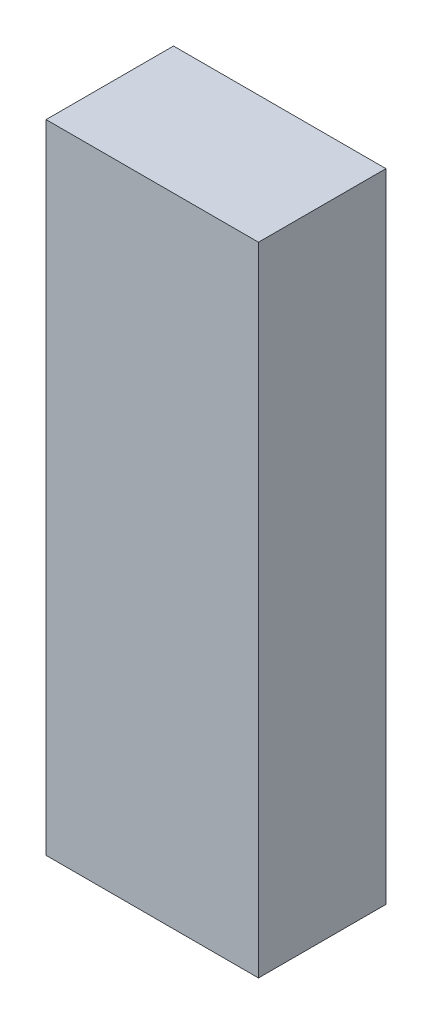
ISO-10303-21;
HEADER;
FILE_DESCRIPTION(('STEP AP214'),'2;1');
FILE_NAME('part.step','',(''),(''),'','','');
FILE_SCHEMA(('AUTOMOTIVE_DESIGN { 1 0 10303 214 1 1 1 1 }'));
ENDSEC;
DATA;
#1=APPLICATION_CONTEXT('core data for automotive mechanical design processes');
#2=APPLICATION_PROTOCOL_DEFINITION('international standard','automotive_design',2000,#1);
#3=PRODUCT_CONTEXT('',#1,'mechanical');
#4=PRODUCT('Part','Part','',(#3));
#5=PRODUCT_RELATED_PRODUCT_CATEGORY('part','',(#4));
#6=PRODUCT_DEFINITION_FORMATION('','',#4);
#7=PRODUCT_DEFINITION_CONTEXT('part definition',#1,'design');
#8=PRODUCT_DEFINITION('design','',#6,#7);
#9=PRODUCT_DEFINITION_SHAPE('','',#8);
#10=(LENGTH_UNIT() NAMED_UNIT(*) SI_UNIT(.MILLI.,.METRE.));
#11=(NAMED_UNIT(*) PLANE_ANGLE_UNIT() SI_UNIT($,.RADIAN.));
#12=(NAMED_UNIT(*) SI_UNIT($,.STERADIAN.) SOLID_ANGLE_UNIT());
#13=UNCERTAINTY_MEASURE_WITH_UNIT(LENGTH_MEASURE(1.E-05),#10,'distance_accuracy_value','');
#14=(GEOMETRIC_REPRESENTATION_CONTEXT(3) GLOBAL_UNCERTAINTY_ASSIGNED_CONTEXT((#13)) GLOBAL_UNIT_ASSIGNED_CONTEXT((#10,
#11,#12)) REPRESENTATION_CONTEXT('',''));
#15=CARTESIAN_POINT('',(0.,0.,0.));
#16=DIRECTION('',(0.,0.,1.));
#17=DIRECTION('',(1.,0.,0.));
#18=AXIS2_PLACEMENT_3D('',#15,#16,#17);
#19=CARTESIAN_POINT('',(25.,-75.,30.));
#20=DIRECTION('',(-1.,0.,0.));
#21=DIRECTION('',(0.,0.,1.));
#22=AXIS2_PLACEMENT_3D('',#19,#20,#21);
#23=PLANE('',#22);
#24=DIRECTION('',(0.,1.,0.));
#25=VECTOR('',#24,1.);
#26=CARTESIAN_POINT('',(25.,-75.,0.));
#27=LINE('',#26,#25);
#28=CARTESIAN_POINT('',(25.,-75.,0.));
#29=VERTEX_POINT('',#28);
#30=CARTESIAN_POINT('',(25.,75.,0.));
#31=VERTEX_POINT('',#30);
#32=EDGE_CURVE('E113',#29,#31,#27,.T.);
#33=ORIENTED_EDGE('',*,*,#32,.T.);
#34=DIRECTION('',(0.,0.,-1.));
#35=VECTOR('',#34,1.);
#36=CARTESIAN_POINT('',(25.,75.,30.));
#37=LINE('',#36,#35);
#38=CARTESIAN_POINT('',(25.,75.,30.));
#39=VERTEX_POINT('',#38);
#40=EDGE_CURVE('E11',#39,#31,#37,.T.);
#41=ORIENTED_EDGE('',*,*,#40,.F.);
#42=DIRECTION('',(0.,1.,0.));
#43=VECTOR('',#42,1.);
#44=CARTESIAN_POINT('',(25.,-75.,30.));
#45=LINE('',#44,#43);
#46=CARTESIAN_POINT('',(25.,-75.,30.));
#47=VERTEX_POINT('',#46);
#48=EDGE_CURVE('E97',#47,#39,#45,.T.);
#49=ORIENTED_EDGE('',*,*,#48,.F.);
#50=DIRECTION('',(0.,0.,-1.));
#51=VECTOR('',#50,1.);
#52=CARTESIAN_POINT('',(25.,-75.,30.));
#53=LINE('',#52,#51);
#54=EDGE_CURVE('E109',#47,#29,#53,.T.);
#55=ORIENTED_EDGE('',*,*,#54,.T.);
#56=EDGE_LOOP('',(#33,#41,#49,#55));
#57=FACE_BOUND('',#56,.T.);
#58=ADVANCED_FACE('F45',(#57),#23,.F.);
#59=CARTESIAN_POINT('',(-25.,75.,30.));
#60=DIRECTION('',(0.,-1.,0.));
#61=DIRECTION('',(0.,0.,-1.));
#62=AXIS2_PLACEMENT_3D('',#59,#60,#61);
#63=PLANE('',#62);
#64=DIRECTION('',(-1.,0.,0.));
#65=VECTOR('',#64,1.);
#66=CARTESIAN_POINT('',(-25.,75.,0.));
#67=LINE('',#66,#65);
#68=CARTESIAN_POINT('',(-25.,75.,0.));
#69=VERTEX_POINT('',#68);
#70=EDGE_CURVE('E102',#31,#69,#67,.T.);
#71=ORIENTED_EDGE('',*,*,#70,.T.);
#72=DIRECTION('',(0.,0.,-1.));
#73=VECTOR('',#72,1.);
#74=CARTESIAN_POINT('',(-25.,75.,30.));
#75=LINE('',#74,#73);
#76=CARTESIAN_POINT('',(-25.,75.,30.));
#77=VERTEX_POINT('',#76);
#78=EDGE_CURVE('E54',#77,#69,#75,.T.);
#79=ORIENTED_EDGE('',*,*,#78,.F.);
#80=DIRECTION('',(-1.,0.,0.));
#81=VECTOR('',#80,1.);
#82=CARTESIAN_POINT('',(-25.,75.,30.));
#83=LINE('',#82,#81);
#84=EDGE_CURVE('E92',#39,#77,#83,.T.);
#85=ORIENTED_EDGE('',*,*,#84,.F.);
#86=ORIENTED_EDGE('',*,*,#40,.T.);
#87=EDGE_LOOP('',(#71,#79,#85,#86));
#88=FACE_BOUND('',#87,.T.);
#89=ADVANCED_FACE('F101',(#88),#63,.F.);
#90=CARTESIAN_POINT('',(-25.,-75.,30.));
#91=DIRECTION('',(1.,0.,0.));
#92=DIRECTION('',(0.,0.,-1.));
#93=AXIS2_PLACEMENT_3D('',#90,#91,#92);
#94=PLANE('',#93);
#95=DIRECTION('',(0.,-1.,0.));
#96=VECTOR('',#95,1.);
#97=CARTESIAN_POINT('',(-25.,-75.,0.));
#98=LINE('',#97,#96);
#99=CARTESIAN_POINT('',(-25.,-75.,0.));
#100=VERTEX_POINT('',#99);
#101=EDGE_CURVE('E79',#69,#100,#98,.T.);
#102=ORIENTED_EDGE('',*,*,#101,.T.);
#103=DIRECTION('',(0.,0.,-1.));
#104=VECTOR('',#103,1.);
#105=CARTESIAN_POINT('',(-25.,-75.,30.));
#106=LINE('',#105,#104);
#107=CARTESIAN_POINT('',(-25.,-75.,30.));
#108=VERTEX_POINT('',#107);
#109=EDGE_CURVE('E104',#108,#100,#106,.T.);
#110=ORIENTED_EDGE('',*,*,#109,.F.);
#111=DIRECTION('',(0.,-1.,0.));
#112=VECTOR('',#111,1.);
#113=CARTESIAN_POINT('',(-25.,-75.,30.));
#114=LINE('',#113,#112);
#115=EDGE_CURVE('E95',#77,#108,#114,.T.);
#116=ORIENTED_EDGE('',*,*,#115,.F.);
#117=ORIENTED_EDGE('',*,*,#78,.T.);
#118=EDGE_LOOP('',(#102,#110,#116,#117));
#119=FACE_BOUND('',#118,.T.);
#120=ADVANCED_FACE('F105',(#119),#94,.F.);
#121=CARTESIAN_POINT('',(-25.,-75.,30.));
#122=DIRECTION('',(0.,1.,0.));
#123=DIRECTION('',(0.,0.,1.));
#124=AXIS2_PLACEMENT_3D('',#121,#122,#123);
#125=PLANE('',#124);
#126=DIRECTION('',(1.,0.,0.));
#127=VECTOR('',#126,1.);
#128=CARTESIAN_POINT('',(-25.,-75.,0.));
#129=LINE('',#128,#127);
#130=EDGE_CURVE('E85',#100,#29,#129,.T.);
#131=ORIENTED_EDGE('',*,*,#130,.T.);
#132=ORIENTED_EDGE('',*,*,#54,.F.);
#133=DIRECTION('',(1.,0.,0.));
#134=VECTOR('',#133,1.);
#135=CARTESIAN_POINT('',(-25.,-75.,30.));
#136=LINE('',#135,#134);
#137=EDGE_CURVE('E62',#108,#47,#136,.T.);
#138=ORIENTED_EDGE('',*,*,#137,.F.);
#139=ORIENTED_EDGE('',*,*,#109,.T.);
#140=EDGE_LOOP('',(#131,#132,#138,#139));
#141=FACE_BOUND('',#140,.T.);
#142=ADVANCED_FACE('F126',(#141),#125,.F.);
#143=CARTESIAN_POINT('',(0.,0.,30.));
#144=DIRECTION('',(0.,0.,-1.));
#145=DIRECTION('',(-1.,0.,0.));
#146=AXIS2_PLACEMENT_3D('',#143,#144,#145);
#147=PLANE('',#146);
#148=ORIENTED_EDGE('',*,*,#48,.T.);
#149=ORIENTED_EDGE('',*,*,#84,.T.);
#150=ORIENTED_EDGE('',*,*,#115,.T.);
#151=ORIENTED_EDGE('',*,*,#137,.T.);
#152=EDGE_LOOP('',(#148,#149,#150,#151));
#153=FACE_BOUND('',#152,.T.);
#154=ADVANCED_FACE('F93',(#153),#147,.F.);
#155=CARTESIAN_POINT('',(0.,0.,0.));
#156=DIRECTION('',(0.,0.,-1.));
#157=DIRECTION('',(-1.,0.,0.));
#158=AXIS2_PLACEMENT_3D('',#155,#156,#157);
#159=PLANE('',#158);
#160=ORIENTED_EDGE('',*,*,#32,.F.);
#161=ORIENTED_EDGE('',*,*,#130,.F.);
#162=ORIENTED_EDGE('',*,*,#101,.F.);
#163=ORIENTED_EDGE('',*,*,#70,.F.);
#164=EDGE_LOOP('',(#160,#161,#162,#163));
#165=FACE_BOUND('',#164,.T.);
#166=ADVANCED_FACE('F129',(#165),#159,.T.);
#167=CLOSED_SHELL('',(#58,#89,#120,#142,#154,#166));
#168=MANIFOLD_SOLID_BREP('B2',#167);
#169=ADVANCED_BREP_SHAPE_REPRESENTATION('',(#18,#168),#14);
#170=SHAPE_DEFINITION_REPRESENTATION(#9,#169);
ENDSEC;
END-ISO-10303-21;
